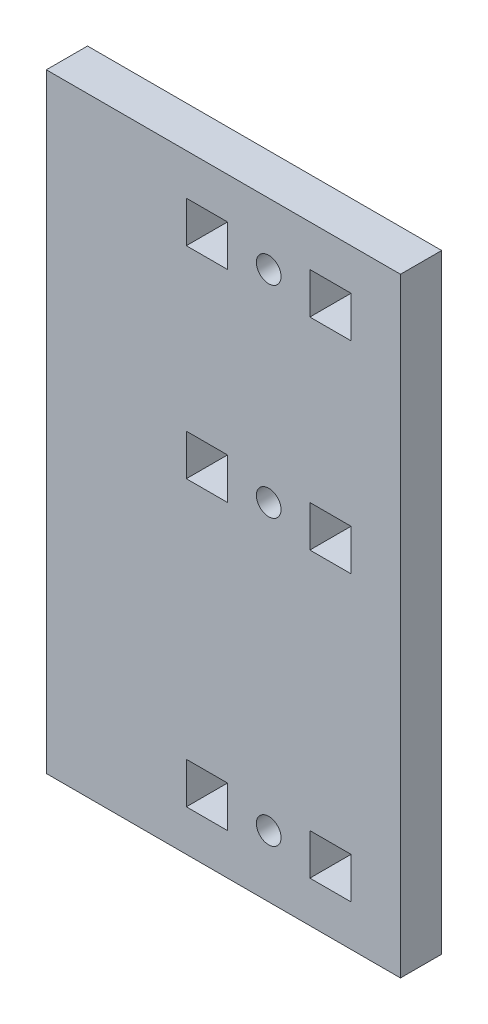
ISO-10303-21;
HEADER;
FILE_DESCRIPTION(('STEP AP214'),'2;1');
FILE_NAME('part.step','',(''),(''),'','','');
FILE_SCHEMA(('AUTOMOTIVE_DESIGN { 1 0 10303 214 1 1 1 1 }'));
ENDSEC;
DATA;
#1=APPLICATION_CONTEXT('core data for automotive mechanical design processes');
#2=APPLICATION_PROTOCOL_DEFINITION('international standard','automotive_design',2000,#1);
#3=PRODUCT_CONTEXT('',#1,'mechanical');
#4=PRODUCT('Part','Part','',(#3));
#5=PRODUCT_RELATED_PRODUCT_CATEGORY('part','',(#4));
#6=PRODUCT_DEFINITION_FORMATION('','',#4);
#7=PRODUCT_DEFINITION_CONTEXT('part definition',#1,'design');
#8=PRODUCT_DEFINITION('design','',#6,#7);
#9=PRODUCT_DEFINITION_SHAPE('','',#8);
#10=(LENGTH_UNIT() NAMED_UNIT(*) SI_UNIT(.MILLI.,.METRE.));
#11=(NAMED_UNIT(*) PLANE_ANGLE_UNIT() SI_UNIT($,.RADIAN.));
#12=(NAMED_UNIT(*) SI_UNIT($,.STERADIAN.) SOLID_ANGLE_UNIT());
#13=UNCERTAINTY_MEASURE_WITH_UNIT(LENGTH_MEASURE(1.E-05),#10,'distance_accuracy_value','');
#14=(GEOMETRIC_REPRESENTATION_CONTEXT(3) GLOBAL_UNCERTAINTY_ASSIGNED_CONTEXT((#13)) GLOBAL_UNIT_ASSIGNED_CONTEXT((#10,
#11,#12)) REPRESENTATION_CONTEXT('',''));
#15=CARTESIAN_POINT('',(0.,0.,0.));
#16=DIRECTION('',(0.,0.,1.));
#17=DIRECTION('',(1.,0.,0.));
#18=AXIS2_PLACEMENT_3D('',#15,#16,#17);
#19=CARTESIAN_POINT('',(0.,0.,5.));
#20=DIRECTION('',(0.,0.,-1.));
#21=DIRECTION('',(-1.,0.,0.));
#22=AXIS2_PLACEMENT_3D('',#19,#20,#21);
#23=PLANE('',#22);
#24=DIRECTION('',(0.,1.,0.));
#25=VECTOR('',#24,1.);
#26=CARTESIAN_POINT('',(-5.,-32.,5.));
#27=LINE('',#26,#25);
#28=CARTESIAN_POINT('',(-5.,-37.,5.));
#29=VERTEX_POINT('',#28);
#30=CARTESIAN_POINT('',(-5.,-32.,5.));
#31=VERTEX_POINT('',#30);
#32=EDGE_CURVE('E257',#29,#31,#27,.T.);
#33=ORIENTED_EDGE('',*,*,#32,.F.);
#34=DIRECTION('',(1.,0.,0.));
#35=VECTOR('',#34,1.);
#36=CARTESIAN_POINT('',(-5.,-37.,5.));
#37=LINE('',#36,#35);
#38=CARTESIAN_POINT('',(-10.,-37.,5.));
#39=VERTEX_POINT('',#38);
#40=EDGE_CURVE('E265',#39,#29,#37,.T.);
#41=ORIENTED_EDGE('',*,*,#40,.F.);
#42=DIRECTION('',(0.,-1.,0.));
#43=VECTOR('',#42,1.);
#44=CARTESIAN_POINT('',(-10.,-32.,5.));
#45=LINE('',#44,#43);
#46=CARTESIAN_POINT('',(-10.,-32.,5.));
#47=VERTEX_POINT('',#46);
#48=EDGE_CURVE('E262',#47,#39,#45,.T.);
#49=ORIENTED_EDGE('',*,*,#48,.F.);
#50=DIRECTION('',(-1.,0.,0.));
#51=VECTOR('',#50,1.);
#52=CARTESIAN_POINT('',(-5.,-32.,5.));
#53=LINE('',#52,#51);
#54=EDGE_CURVE('E259',#31,#47,#53,.T.);
#55=ORIENTED_EDGE('',*,*,#54,.F.);
#56=EDGE_LOOP('',(#33,#41,#49,#55));
#57=FACE_BOUND('',#56,.T.);
#58=DIRECTION('',(0.,1.,0.));
#59=VECTOR('',#58,1.);
#60=CARTESIAN_POINT('',(-5.,27.,5.));
#61=LINE('',#60,#59);
#62=CARTESIAN_POINT('',(-5.,22.,5.));
#63=VERTEX_POINT('',#62);
#64=CARTESIAN_POINT('',(-5.,27.,5.));
#65=VERTEX_POINT('',#64);
#66=EDGE_CURVE('E325',#63,#65,#61,.T.);
#67=ORIENTED_EDGE('',*,*,#66,.F.);
#68=DIRECTION('',(1.,0.,0.));
#69=VECTOR('',#68,1.);
#70=CARTESIAN_POINT('',(-5.,22.,5.));
#71=LINE('',#70,#69);
#72=CARTESIAN_POINT('',(-10.,22.,5.));
#73=VERTEX_POINT('',#72);
#74=EDGE_CURVE('E333',#73,#63,#71,.T.);
#75=ORIENTED_EDGE('',*,*,#74,.F.);
#76=DIRECTION('',(0.,-1.,0.));
#77=VECTOR('',#76,1.);
#78=CARTESIAN_POINT('',(-10.,27.,5.));
#79=LINE('',#78,#77);
#80=CARTESIAN_POINT('',(-10.,27.,5.));
#81=VERTEX_POINT('',#80);
#82=EDGE_CURVE('E330',#81,#73,#79,.T.);
#83=ORIENTED_EDGE('',*,*,#82,.F.);
#84=DIRECTION('',(-1.,0.,0.));
#85=VECTOR('',#84,1.);
#86=CARTESIAN_POINT('',(-5.,27.,5.));
#87=LINE('',#86,#85);
#88=EDGE_CURVE('E327',#65,#81,#87,.T.);
#89=ORIENTED_EDGE('',*,*,#88,.F.);
#90=EDGE_LOOP('',(#67,#75,#83,#89));
#91=FACE_BOUND('',#90,.T.);
#92=DIRECTION('',(0.,1.,0.));
#93=VECTOR('',#92,1.);
#94=CARTESIAN_POINT('',(-5.,2.5,5.));
#95=LINE('',#94,#93);
#96=CARTESIAN_POINT('',(-5.,-2.5,5.));
#97=VERTEX_POINT('',#96);
#98=CARTESIAN_POINT('',(-5.,2.5,5.));
#99=VERTEX_POINT('',#98);
#100=EDGE_CURVE('E393',#97,#99,#95,.T.);
#101=ORIENTED_EDGE('',*,*,#100,.F.);
#102=DIRECTION('',(1.,0.,0.));
#103=VECTOR('',#102,1.);
#104=CARTESIAN_POINT('',(-5.,-2.5,5.));
#105=LINE('',#104,#103);
#106=CARTESIAN_POINT('',(-10.,-2.5,5.));
#107=VERTEX_POINT('',#106);
#108=EDGE_CURVE('E401',#107,#97,#105,.T.);
#109=ORIENTED_EDGE('',*,*,#108,.F.);
#110=DIRECTION('',(0.,-1.,0.));
#111=VECTOR('',#110,1.);
#112=CARTESIAN_POINT('',(-10.,2.5,5.));
#113=LINE('',#112,#111);
#114=CARTESIAN_POINT('',(-10.,2.5,5.));
#115=VERTEX_POINT('',#114);
#116=EDGE_CURVE('E398',#115,#107,#113,.T.);
#117=ORIENTED_EDGE('',*,*,#116,.F.);
#118=DIRECTION('',(-1.,0.,0.));
#119=VECTOR('',#118,1.);
#120=CARTESIAN_POINT('',(-5.,2.5,5.));
#121=LINE('',#120,#119);
#122=EDGE_CURVE('E395',#99,#115,#121,.T.);
#123=ORIENTED_EDGE('',*,*,#122,.F.);
#124=EDGE_LOOP('',(#101,#109,#117,#123));
#125=FACE_BOUND('',#124,.T.);
#126=DIRECTION('',(0.,1.,0.));
#127=VECTOR('',#126,1.);
#128=CARTESIAN_POINT('',(16.,-42.,5.));
#129=LINE('',#128,#127);
#130=CARTESIAN_POINT('',(16.,-42.,5.));
#131=VERTEX_POINT('',#130);
#132=CARTESIAN_POINT('',(16.,32.,5.));
#133=VERTEX_POINT('',#132);
#134=EDGE_CURVE('E424',#131,#133,#129,.T.);
#135=ORIENTED_EDGE('',*,*,#134,.T.);
#136=DIRECTION('',(-1.,0.,0.));
#137=VECTOR('',#136,1.);
#138=CARTESIAN_POINT('',(-27.,32.,5.));
#139=LINE('',#138,#137);
#140=CARTESIAN_POINT('',(-27.,32.,5.));
#141=VERTEX_POINT('',#140);
#142=EDGE_CURVE('E427',#133,#141,#139,.T.);
#143=ORIENTED_EDGE('',*,*,#142,.T.);
#144=DIRECTION('',(0.,-1.,0.));
#145=VECTOR('',#144,1.);
#146=CARTESIAN_POINT('',(-27.,-42.,5.));
#147=LINE('',#146,#145);
#148=CARTESIAN_POINT('',(-27.,-42.,5.));
#149=VERTEX_POINT('',#148);
#150=EDGE_CURVE('E430',#141,#149,#147,.T.);
#151=ORIENTED_EDGE('',*,*,#150,.T.);
#152=DIRECTION('',(1.,0.,0.));
#153=VECTOR('',#152,1.);
#154=CARTESIAN_POINT('',(-27.,-42.,5.));
#155=LINE('',#154,#153);
#156=EDGE_CURVE('E432',#149,#131,#155,.T.);
#157=ORIENTED_EDGE('',*,*,#156,.T.);
#158=EDGE_LOOP('',(#135,#143,#151,#157));
#159=FACE_BOUND('',#158,.T.);
#160=DIRECTION('',(0.,-1.,0.));
#161=VECTOR('',#160,1.);
#162=CARTESIAN_POINT('',(5.,2.5,5.));
#163=LINE('',#162,#161);
#164=CARTESIAN_POINT('',(5.,2.5,5.));
#165=VERTEX_POINT('',#164);
#166=CARTESIAN_POINT('',(5.,-2.5,5.));
#167=VERTEX_POINT('',#166);
#168=EDGE_CURVE('E362',#165,#167,#163,.T.);
#169=ORIENTED_EDGE('',*,*,#168,.F.);
#170=DIRECTION('',(-1.,0.,0.));
#171=VECTOR('',#170,1.);
#172=CARTESIAN_POINT('',(5.,2.5,5.));
#173=LINE('',#172,#171);
#174=CARTESIAN_POINT('',(10.,2.5,5.));
#175=VERTEX_POINT('',#174);
#176=EDGE_CURVE('E370',#175,#165,#173,.T.);
#177=ORIENTED_EDGE('',*,*,#176,.F.);
#178=DIRECTION('',(0.,1.,0.));
#179=VECTOR('',#178,1.);
#180=CARTESIAN_POINT('',(10.,2.5,5.));
#181=LINE('',#180,#179);
#182=CARTESIAN_POINT('',(10.,-2.5,5.));
#183=VERTEX_POINT('',#182);
#184=EDGE_CURVE('E367',#183,#175,#181,.T.);
#185=ORIENTED_EDGE('',*,*,#184,.F.);
#186=DIRECTION('',(1.,0.,0.));
#187=VECTOR('',#186,1.);
#188=CARTESIAN_POINT('',(5.,-2.5,5.));
#189=LINE('',#188,#187);
#190=EDGE_CURVE('E364',#167,#183,#189,.T.);
#191=ORIENTED_EDGE('',*,*,#190,.F.);
#192=EDGE_LOOP('',(#169,#177,#185,#191));
#193=FACE_BOUND('',#192,.T.);
#194=CARTESIAN_POINT('',(0.,0.,5.));
#195=DIRECTION('',(0.,0.,1.));
#196=DIRECTION('',(1.,0.,0.));
#197=AXIS2_PLACEMENT_3D('',#194,#195,#196);
#198=CIRCLE('',#197,1.5);
#199=CARTESIAN_POINT('',(1.5,0.,5.));
#200=VERTEX_POINT('',#199);
#201=EDGE_CURVE('E356',#200,#200,#198,.T.);
#202=ORIENTED_EDGE('',*,*,#201,.F.);
#203=EDGE_LOOP('',(#202));
#204=FACE_BOUND('',#203,.T.);
#205=DIRECTION('',(0.,-1.,0.));
#206=VECTOR('',#205,1.);
#207=CARTESIAN_POINT('',(5.,27.,5.));
#208=LINE('',#207,#206);
#209=CARTESIAN_POINT('',(5.,27.,5.));
#210=VERTEX_POINT('',#209);
#211=CARTESIAN_POINT('',(5.,22.,5.));
#212=VERTEX_POINT('',#211);
#213=EDGE_CURVE('E294',#210,#212,#208,.T.);
#214=ORIENTED_EDGE('',*,*,#213,.F.);
#215=DIRECTION('',(-1.,0.,0.));
#216=VECTOR('',#215,1.);
#217=CARTESIAN_POINT('',(5.,27.,5.));
#218=LINE('',#217,#216);
#219=CARTESIAN_POINT('',(10.,27.,5.));
#220=VERTEX_POINT('',#219);
#221=EDGE_CURVE('E302',#220,#210,#218,.T.);
#222=ORIENTED_EDGE('',*,*,#221,.F.);
#223=DIRECTION('',(0.,1.,0.));
#224=VECTOR('',#223,1.);
#225=CARTESIAN_POINT('',(10.,27.,5.));
#226=LINE('',#225,#224);
#227=CARTESIAN_POINT('',(10.,22.,5.));
#228=VERTEX_POINT('',#227);
#229=EDGE_CURVE('E299',#228,#220,#226,.T.);
#230=ORIENTED_EDGE('',*,*,#229,.F.);
#231=DIRECTION('',(1.,0.,0.));
#232=VECTOR('',#231,1.);
#233=CARTESIAN_POINT('',(5.,22.,5.));
#234=LINE('',#233,#232);
#235=EDGE_CURVE('E296',#212,#228,#234,.T.);
#236=ORIENTED_EDGE('',*,*,#235,.F.);
#237=EDGE_LOOP('',(#214,#222,#230,#236));
#238=FACE_BOUND('',#237,.T.);
#239=CARTESIAN_POINT('',(0.,24.5,5.));
#240=DIRECTION('',(0.,0.,1.));
#241=DIRECTION('',(1.,0.,0.));
#242=AXIS2_PLACEMENT_3D('',#239,#240,#241);
#243=CIRCLE('',#242,1.5);
#244=CARTESIAN_POINT('',(1.5,24.5,5.));
#245=VERTEX_POINT('',#244);
#246=EDGE_CURVE('E288',#245,#245,#243,.T.);
#247=ORIENTED_EDGE('',*,*,#246,.F.);
#248=EDGE_LOOP('',(#247));
#249=FACE_BOUND('',#248,.T.);
#250=DIRECTION('',(0.,-1.,0.));
#251=VECTOR('',#250,1.);
#252=CARTESIAN_POINT('',(5.,-32.,5.));
#253=LINE('',#252,#251);
#254=CARTESIAN_POINT('',(5.,-32.,5.));
#255=VERTEX_POINT('',#254);
#256=CARTESIAN_POINT('',(5.,-37.,5.));
#257=VERTEX_POINT('',#256);
#258=EDGE_CURVE('E218',#255,#257,#253,.T.);
#259=ORIENTED_EDGE('',*,*,#258,.F.);
#260=DIRECTION('',(-1.,0.,0.));
#261=VECTOR('',#260,1.);
#262=CARTESIAN_POINT('',(5.,-32.,5.));
#263=LINE('',#262,#261);
#264=CARTESIAN_POINT('',(10.,-32.,5.));
#265=VERTEX_POINT('',#264);
#266=EDGE_CURVE('E241',#265,#255,#263,.T.);
#267=ORIENTED_EDGE('',*,*,#266,.F.);
#268=DIRECTION('',(0.,1.,0.));
#269=VECTOR('',#268,1.);
#270=CARTESIAN_POINT('',(10.,-32.,5.));
#271=LINE('',#270,#269);
#272=CARTESIAN_POINT('',(10.,-37.,5.));
#273=VERTEX_POINT('',#272);
#274=EDGE_CURVE('E239',#273,#265,#271,.T.);
#275=ORIENTED_EDGE('',*,*,#274,.F.);
#276=DIRECTION('',(1.,0.,0.));
#277=VECTOR('',#276,1.);
#278=CARTESIAN_POINT('',(5.,-37.,5.));
#279=LINE('',#278,#277);
#280=EDGE_CURVE('E226',#257,#273,#279,.T.);
#281=ORIENTED_EDGE('',*,*,#280,.F.);
#282=EDGE_LOOP('',(#259,#267,#275,#281));
#283=FACE_BOUND('',#282,.T.);
#284=CARTESIAN_POINT('',(0.,-34.5,5.));
#285=DIRECTION('',(0.,0.,1.));
#286=DIRECTION('',(1.,0.,0.));
#287=AXIS2_PLACEMENT_3D('',#284,#285,#286);
#288=CIRCLE('',#287,1.5);
#289=CARTESIAN_POINT('',(1.5,-34.5,5.));
#290=VERTEX_POINT('',#289);
#291=EDGE_CURVE('E247',#290,#290,#288,.T.);
#292=ORIENTED_EDGE('',*,*,#291,.F.);
#293=EDGE_LOOP('',(#292));
#294=FACE_BOUND('',#293,.T.);
#295=ADVANCED_FACE('F33',(#57,#91,#125,#159,#193,#204,#238,#249,#283,#294),#23,.F.);
#296=CARTESIAN_POINT('',(0.,0.,0.));
#297=DIRECTION('',(0.,0.,-1.));
#298=DIRECTION('',(-1.,0.,0.));
#299=AXIS2_PLACEMENT_3D('',#296,#297,#298);
#300=PLANE('',#299);
#301=DIRECTION('',(-1.,0.,0.));
#302=VECTOR('',#301,1.);
#303=CARTESIAN_POINT('',(5.,-32.,0.));
#304=LINE('',#303,#302);
#305=CARTESIAN_POINT('',(10.,-32.,0.));
#306=VERTEX_POINT('',#305);
#307=CARTESIAN_POINT('',(5.,-32.,0.));
#308=VERTEX_POINT('',#307);
#309=EDGE_CURVE('E227',#306,#308,#304,.T.);
#310=ORIENTED_EDGE('',*,*,#309,.T.);
#311=DIRECTION('',(0.,-1.,0.));
#312=VECTOR('',#311,1.);
#313=CARTESIAN_POINT('',(5.,-32.,0.));
#314=LINE('',#313,#312);
#315=CARTESIAN_POINT('',(5.,-37.,0.));
#316=VERTEX_POINT('',#315);
#317=EDGE_CURVE('E56',#308,#316,#314,.T.);
#318=ORIENTED_EDGE('',*,*,#317,.T.);
#319=DIRECTION('',(1.,0.,0.));
#320=VECTOR('',#319,1.);
#321=CARTESIAN_POINT('',(5.,-37.,0.));
#322=LINE('',#321,#320);
#323=CARTESIAN_POINT('',(10.,-37.,0.));
#324=VERTEX_POINT('',#323);
#325=EDGE_CURVE('E233',#316,#324,#322,.T.);
#326=ORIENTED_EDGE('',*,*,#325,.T.);
#327=DIRECTION('',(0.,1.,0.));
#328=VECTOR('',#327,1.);
#329=CARTESIAN_POINT('',(10.,-32.,0.));
#330=LINE('',#329,#328);
#331=EDGE_CURVE('E249',#324,#306,#330,.T.);
#332=ORIENTED_EDGE('',*,*,#331,.T.);
#333=EDGE_LOOP('',(#310,#318,#326,#332));
#334=FACE_BOUND('',#333,.T.);
#335=DIRECTION('',(1.,0.,0.));
#336=VECTOR('',#335,1.);
#337=CARTESIAN_POINT('',(-5.,-37.,0.));
#338=LINE('',#337,#336);
#339=CARTESIAN_POINT('',(-10.,-37.,0.));
#340=VERTEX_POINT('',#339);
#341=CARTESIAN_POINT('',(-5.,-37.,0.));
#342=VERTEX_POINT('',#341);
#343=EDGE_CURVE('E260',#340,#342,#338,.T.);
#344=ORIENTED_EDGE('',*,*,#343,.T.);
#345=DIRECTION('',(0.,1.,0.));
#346=VECTOR('',#345,1.);
#347=CARTESIAN_POINT('',(-5.,-32.,0.));
#348=LINE('',#347,#346);
#349=CARTESIAN_POINT('',(-5.,-32.,0.));
#350=VERTEX_POINT('',#349);
#351=EDGE_CURVE('E234',#342,#350,#348,.T.);
#352=ORIENTED_EDGE('',*,*,#351,.T.);
#353=DIRECTION('',(-1.,0.,0.));
#354=VECTOR('',#353,1.);
#355=CARTESIAN_POINT('',(-5.,-32.,0.));
#356=LINE('',#355,#354);
#357=CARTESIAN_POINT('',(-10.,-32.,0.));
#358=VERTEX_POINT('',#357);
#359=EDGE_CURVE('E270',#350,#358,#356,.T.);
#360=ORIENTED_EDGE('',*,*,#359,.T.);
#361=DIRECTION('',(0.,-1.,0.));
#362=VECTOR('',#361,1.);
#363=CARTESIAN_POINT('',(-10.,-32.,0.));
#364=LINE('',#363,#362);
#365=EDGE_CURVE('E273',#358,#340,#364,.T.);
#366=ORIENTED_EDGE('',*,*,#365,.T.);
#367=EDGE_LOOP('',(#344,#352,#360,#366));
#368=FACE_BOUND('',#367,.T.);
#369=CARTESIAN_POINT('',(0.,24.5,0.));
#370=DIRECTION('',(0.,0.,1.));
#371=DIRECTION('',(1.,0.,0.));
#372=AXIS2_PLACEMENT_3D('',#369,#370,#371);
#373=CIRCLE('',#372,1.5);
#374=CARTESIAN_POINT('',(1.5,24.5,0.));
#375=VERTEX_POINT('',#374);
#376=EDGE_CURVE('E287',#375,#375,#373,.T.);
#377=ORIENTED_EDGE('',*,*,#376,.T.);
#378=EDGE_LOOP('',(#377));
#379=FACE_BOUND('',#378,.T.);
#380=DIRECTION('',(-1.,0.,0.));
#381=VECTOR('',#380,1.);
#382=CARTESIAN_POINT('',(5.,2.5,0.));
#383=LINE('',#382,#381);
#384=CARTESIAN_POINT('',(10.,2.5,0.));
#385=VERTEX_POINT('',#384);
#386=CARTESIAN_POINT('',(5.,2.5,0.));
#387=VERTEX_POINT('',#386);
#388=EDGE_CURVE('E365',#385,#387,#383,.T.);
#389=ORIENTED_EDGE('',*,*,#388,.T.);
#390=DIRECTION('',(0.,-1.,0.));
#391=VECTOR('',#390,1.);
#392=CARTESIAN_POINT('',(5.,2.5,0.));
#393=LINE('',#392,#391);
#394=CARTESIAN_POINT('',(5.,-2.5,0.));
#395=VERTEX_POINT('',#394);
#396=EDGE_CURVE('E359',#387,#395,#393,.T.);
#397=ORIENTED_EDGE('',*,*,#396,.T.);
#398=DIRECTION('',(1.,0.,0.));
#399=VECTOR('',#398,1.);
#400=CARTESIAN_POINT('',(5.,-2.5,0.));
#401=LINE('',#400,#399);
#402=CARTESIAN_POINT('',(10.,-2.5,0.));
#403=VERTEX_POINT('',#402);
#404=EDGE_CURVE('E375',#395,#403,#401,.T.);
#405=ORIENTED_EDGE('',*,*,#404,.T.);
#406=DIRECTION('',(0.,1.,0.));
#407=VECTOR('',#406,1.);
#408=CARTESIAN_POINT('',(10.,2.5,0.));
#409=LINE('',#408,#407);
#410=EDGE_CURVE('E378',#403,#385,#409,.T.);
#411=ORIENTED_EDGE('',*,*,#410,.T.);
#412=EDGE_LOOP('',(#389,#397,#405,#411));
#413=FACE_BOUND('',#412,.T.);
#414=DIRECTION('',(1.,0.,0.));
#415=VECTOR('',#414,1.);
#416=CARTESIAN_POINT('',(-5.,-2.5,0.));
#417=LINE('',#416,#415);
#418=CARTESIAN_POINT('',(-10.,-2.5,0.));
#419=VERTEX_POINT('',#418);
#420=CARTESIAN_POINT('',(-5.,-2.5,0.));
#421=VERTEX_POINT('',#420);
#422=EDGE_CURVE('E396',#419,#421,#417,.T.);
#423=ORIENTED_EDGE('',*,*,#422,.T.);
#424=DIRECTION('',(0.,1.,0.));
#425=VECTOR('',#424,1.);
#426=CARTESIAN_POINT('',(-5.,2.5,0.));
#427=LINE('',#426,#425);
#428=CARTESIAN_POINT('',(-5.,2.5,0.));
#429=VERTEX_POINT('',#428);
#430=EDGE_CURVE('E392',#421,#429,#427,.T.);
#431=ORIENTED_EDGE('',*,*,#430,.T.);
#432=DIRECTION('',(-1.,0.,0.));
#433=VECTOR('',#432,1.);
#434=CARTESIAN_POINT('',(-5.,2.5,0.));
#435=LINE('',#434,#433);
#436=CARTESIAN_POINT('',(-10.,2.5,0.));
#437=VERTEX_POINT('',#436);
#438=EDGE_CURVE('E406',#429,#437,#435,.T.);
#439=ORIENTED_EDGE('',*,*,#438,.T.);
#440=DIRECTION('',(0.,-1.,0.));
#441=VECTOR('',#440,1.);
#442=CARTESIAN_POINT('',(-10.,2.5,0.));
#443=LINE('',#442,#441);
#444=EDGE_CURVE('E409',#437,#419,#443,.T.);
#445=ORIENTED_EDGE('',*,*,#444,.T.);
#446=EDGE_LOOP('',(#423,#431,#439,#445));
#447=FACE_BOUND('',#446,.T.);
#448=DIRECTION('',(0.,1.,0.));
#449=VECTOR('',#448,1.);
#450=CARTESIAN_POINT('',(16.,-42.,0.));
#451=LINE('',#450,#449);
#452=CARTESIAN_POINT('',(16.,-42.,0.));
#453=VERTEX_POINT('',#452);
#454=CARTESIAN_POINT('',(16.,32.,0.));
#455=VERTEX_POINT('',#454);
#456=EDGE_CURVE('E423',#453,#455,#451,.T.);
#457=ORIENTED_EDGE('',*,*,#456,.F.);
#458=DIRECTION('',(1.,0.,0.));
#459=VECTOR('',#458,1.);
#460=CARTESIAN_POINT('',(-27.,-42.,0.));
#461=LINE('',#460,#459);
#462=CARTESIAN_POINT('',(-27.,-42.,0.));
#463=VERTEX_POINT('',#462);
#464=EDGE_CURVE('E428',#463,#453,#461,.T.);
#465=ORIENTED_EDGE('',*,*,#464,.F.);
#466=DIRECTION('',(0.,-1.,0.));
#467=VECTOR('',#466,1.);
#468=CARTESIAN_POINT('',(-27.,-42.,0.));
#469=LINE('',#468,#467);
#470=CARTESIAN_POINT('',(-27.,32.,0.));
#471=VERTEX_POINT('',#470);
#472=EDGE_CURVE('E439',#471,#463,#469,.T.);
#473=ORIENTED_EDGE('',*,*,#472,.F.);
#474=DIRECTION('',(-1.,0.,0.));
#475=VECTOR('',#474,1.);
#476=CARTESIAN_POINT('',(-27.,32.,0.));
#477=LINE('',#476,#475);
#478=EDGE_CURVE('E437',#455,#471,#477,.T.);
#479=ORIENTED_EDGE('',*,*,#478,.F.);
#480=EDGE_LOOP('',(#457,#465,#473,#479));
#481=FACE_BOUND('',#480,.T.);
#482=CARTESIAN_POINT('',(0.,0.,0.));
#483=DIRECTION('',(0.,0.,1.));
#484=DIRECTION('',(1.,0.,0.));
#485=AXIS2_PLACEMENT_3D('',#482,#483,#484);
#486=CIRCLE('',#485,1.5);
#487=CARTESIAN_POINT('',(1.5,0.,0.));
#488=VERTEX_POINT('',#487);
#489=EDGE_CURVE('E355',#488,#488,#486,.T.);
#490=ORIENTED_EDGE('',*,*,#489,.T.);
#491=EDGE_LOOP('',(#490));
#492=FACE_BOUND('',#491,.T.);
#493=DIRECTION('',(1.,0.,0.));
#494=VECTOR('',#493,1.);
#495=CARTESIAN_POINT('',(-5.,22.,0.));
#496=LINE('',#495,#494);
#497=CARTESIAN_POINT('',(-10.,22.,0.));
#498=VERTEX_POINT('',#497);
#499=CARTESIAN_POINT('',(-5.,22.,0.));
#500=VERTEX_POINT('',#499);
#501=EDGE_CURVE('E328',#498,#500,#496,.T.);
#502=ORIENTED_EDGE('',*,*,#501,.T.);
#503=DIRECTION('',(0.,1.,0.));
#504=VECTOR('',#503,1.);
#505=CARTESIAN_POINT('',(-5.,27.,0.));
#506=LINE('',#505,#504);
#507=CARTESIAN_POINT('',(-5.,27.,0.));
#508=VERTEX_POINT('',#507);
#509=EDGE_CURVE('E324',#500,#508,#506,.T.);
#510=ORIENTED_EDGE('',*,*,#509,.T.);
#511=DIRECTION('',(-1.,0.,0.));
#512=VECTOR('',#511,1.);
#513=CARTESIAN_POINT('',(-5.,27.,0.));
#514=LINE('',#513,#512);
#515=CARTESIAN_POINT('',(-10.,27.,0.));
#516=VERTEX_POINT('',#515);
#517=EDGE_CURVE('E338',#508,#516,#514,.T.);
#518=ORIENTED_EDGE('',*,*,#517,.T.);
#519=DIRECTION('',(0.,-1.,0.));
#520=VECTOR('',#519,1.);
#521=CARTESIAN_POINT('',(-10.,27.,0.));
#522=LINE('',#521,#520);
#523=EDGE_CURVE('E341',#516,#498,#522,.T.);
#524=ORIENTED_EDGE('',*,*,#523,.T.);
#525=EDGE_LOOP('',(#502,#510,#518,#524));
#526=FACE_BOUND('',#525,.T.);
#527=DIRECTION('',(-1.,0.,0.));
#528=VECTOR('',#527,1.);
#529=CARTESIAN_POINT('',(5.,27.,0.));
#530=LINE('',#529,#528);
#531=CARTESIAN_POINT('',(10.,27.,0.));
#532=VERTEX_POINT('',#531);
#533=CARTESIAN_POINT('',(5.,27.,0.));
#534=VERTEX_POINT('',#533);
#535=EDGE_CURVE('E297',#532,#534,#530,.T.);
#536=ORIENTED_EDGE('',*,*,#535,.T.);
#537=DIRECTION('',(0.,-1.,0.));
#538=VECTOR('',#537,1.);
#539=CARTESIAN_POINT('',(5.,27.,0.));
#540=LINE('',#539,#538);
#541=CARTESIAN_POINT('',(5.,22.,0.));
#542=VERTEX_POINT('',#541);
#543=EDGE_CURVE('E291',#534,#542,#540,.T.);
#544=ORIENTED_EDGE('',*,*,#543,.T.);
#545=DIRECTION('',(1.,0.,0.));
#546=VECTOR('',#545,1.);
#547=CARTESIAN_POINT('',(5.,22.,0.));
#548=LINE('',#547,#546);
#549=CARTESIAN_POINT('',(10.,22.,0.));
#550=VERTEX_POINT('',#549);
#551=EDGE_CURVE('E307',#542,#550,#548,.T.);
#552=ORIENTED_EDGE('',*,*,#551,.T.);
#553=DIRECTION('',(0.,1.,0.));
#554=VECTOR('',#553,1.);
#555=CARTESIAN_POINT('',(10.,27.,0.));
#556=LINE('',#555,#554);
#557=EDGE_CURVE('E310',#550,#532,#556,.T.);
#558=ORIENTED_EDGE('',*,*,#557,.T.);
#559=EDGE_LOOP('',(#536,#544,#552,#558));
#560=FACE_BOUND('',#559,.T.);
#561=CARTESIAN_POINT('',(0.,-34.5,0.));
#562=DIRECTION('',(0.,0.,1.));
#563=DIRECTION('',(1.,0.,0.));
#564=AXIS2_PLACEMENT_3D('',#561,#562,#563);
#565=CIRCLE('',#564,1.5);
#566=CARTESIAN_POINT('',(1.5,-34.5,0.));
#567=VERTEX_POINT('',#566);
#568=EDGE_CURVE('E614',#567,#567,#565,.T.);
#569=ORIENTED_EDGE('',*,*,#568,.T.);
#570=EDGE_LOOP('',(#569));
#571=FACE_BOUND('',#570,.T.);
#572=ADVANCED_FACE('F457',(#334,#368,#379,#413,#447,#481,#492,#526,#560,#571),#300,.T.);
#573=CARTESIAN_POINT('',(16.,-42.,5.));
#574=DIRECTION('',(-1.,0.,0.));
#575=DIRECTION('',(0.,0.,1.));
#576=AXIS2_PLACEMENT_3D('',#573,#574,#575);
#577=PLANE('',#576);
#578=ORIENTED_EDGE('',*,*,#456,.T.);
#579=DIRECTION('',(0.,0.,-1.));
#580=VECTOR('',#579,1.);
#581=CARTESIAN_POINT('',(16.,32.,5.));
#582=LINE('',#581,#580);
#583=EDGE_CURVE('E11',#133,#455,#582,.T.);
#584=ORIENTED_EDGE('',*,*,#583,.F.);
#585=ORIENTED_EDGE('',*,*,#134,.F.);
#586=DIRECTION('',(0.,0.,-1.));
#587=VECTOR('',#586,1.);
#588=CARTESIAN_POINT('',(16.,-42.,5.));
#589=LINE('',#588,#587);
#590=EDGE_CURVE('E434',#131,#453,#589,.T.);
#591=ORIENTED_EDGE('',*,*,#590,.T.);
#592=EDGE_LOOP('',(#578,#584,#585,#591));
#593=FACE_BOUND('',#592,.T.);
#594=ADVANCED_FACE('F35',(#593),#577,.F.);
#595=CARTESIAN_POINT('',(-27.,32.,5.));
#596=DIRECTION('',(0.,-1.,0.));
#597=DIRECTION('',(0.,0.,-1.));
#598=AXIS2_PLACEMENT_3D('',#595,#596,#597);
#599=PLANE('',#598);
#600=ORIENTED_EDGE('',*,*,#478,.T.);
#601=DIRECTION('',(0.,0.,-1.));
#602=VECTOR('',#601,1.);
#603=CARTESIAN_POINT('',(-27.,32.,5.));
#604=LINE('',#603,#602);
#605=EDGE_CURVE('E41',#141,#471,#604,.T.);
#606=ORIENTED_EDGE('',*,*,#605,.F.);
#607=ORIENTED_EDGE('',*,*,#142,.F.);
#608=ORIENTED_EDGE('',*,*,#583,.T.);
#609=EDGE_LOOP('',(#600,#606,#607,#608));
#610=FACE_BOUND('',#609,.T.);
#611=ADVANCED_FACE('F468',(#610),#599,.F.);
#612=CARTESIAN_POINT('',(-27.,-42.,5.));
#613=DIRECTION('',(1.,0.,0.));
#614=DIRECTION('',(0.,0.,-1.));
#615=AXIS2_PLACEMENT_3D('',#612,#613,#614);
#616=PLANE('',#615);
#617=ORIENTED_EDGE('',*,*,#472,.T.);
#618=DIRECTION('',(0.,0.,-1.));
#619=VECTOR('',#618,1.);
#620=CARTESIAN_POINT('',(-27.,-42.,5.));
#621=LINE('',#620,#619);
#622=EDGE_CURVE('E444',#149,#463,#621,.T.);
#623=ORIENTED_EDGE('',*,*,#622,.F.);
#624=ORIENTED_EDGE('',*,*,#150,.F.);
#625=ORIENTED_EDGE('',*,*,#605,.T.);
#626=EDGE_LOOP('',(#617,#623,#624,#625));
#627=FACE_BOUND('',#626,.T.);
#628=ADVANCED_FACE('F451',(#627),#616,.F.);
#629=CARTESIAN_POINT('',(-27.,-42.,5.));
#630=DIRECTION('',(0.,1.,0.));
#631=DIRECTION('',(0.,0.,1.));
#632=AXIS2_PLACEMENT_3D('',#629,#630,#631);
#633=PLANE('',#632);
#634=ORIENTED_EDGE('',*,*,#464,.T.);
#635=ORIENTED_EDGE('',*,*,#590,.F.);
#636=ORIENTED_EDGE('',*,*,#156,.F.);
#637=ORIENTED_EDGE('',*,*,#622,.T.);
#638=EDGE_LOOP('',(#634,#635,#636,#637));
#639=FACE_BOUND('',#638,.T.);
#640=ADVANCED_FACE('F461',(#639),#633,.F.);
#641=CARTESIAN_POINT('',(-5.,2.5,5.));
#642=DIRECTION('',(-1.,0.,0.));
#643=DIRECTION('',(0.,0.,1.));
#644=AXIS2_PLACEMENT_3D('',#641,#642,#643);
#645=PLANE('',#644);
#646=ORIENTED_EDGE('',*,*,#430,.F.);
#647=DIRECTION('',(0.,0.,-1.));
#648=VECTOR('',#647,1.);
#649=CARTESIAN_POINT('',(-5.,-2.5,5.));
#650=LINE('',#649,#648);
#651=EDGE_CURVE('E403',#97,#421,#650,.T.);
#652=ORIENTED_EDGE('',*,*,#651,.F.);
#653=ORIENTED_EDGE('',*,*,#100,.T.);
#654=DIRECTION('',(0.,0.,-1.));
#655=VECTOR('',#654,1.);
#656=CARTESIAN_POINT('',(-5.,2.5,5.));
#657=LINE('',#656,#655);
#658=EDGE_CURVE('E420',#99,#429,#657,.T.);
#659=ORIENTED_EDGE('',*,*,#658,.T.);
#660=EDGE_LOOP('',(#646,#652,#653,#659));
#661=FACE_BOUND('',#660,.T.);
#662=ADVANCED_FACE('F486',(#661),#645,.T.);
#663=CARTESIAN_POINT('',(-5.,2.5,5.));
#664=DIRECTION('',(0.,-1.,0.));
#665=DIRECTION('',(1.,0.,0.));
#666=AXIS2_PLACEMENT_3D('',#663,#664,#665);
#667=PLANE('',#666);
#668=ORIENTED_EDGE('',*,*,#438,.F.);
#669=ORIENTED_EDGE('',*,*,#658,.F.);
#670=ORIENTED_EDGE('',*,*,#122,.T.);
#671=DIRECTION('',(0.,0.,-1.));
#672=VECTOR('',#671,1.);
#673=CARTESIAN_POINT('',(-10.,2.5,5.));
#674=LINE('',#673,#672);
#675=EDGE_CURVE('E418',#115,#437,#674,.T.);
#676=ORIENTED_EDGE('',*,*,#675,.T.);
#677=EDGE_LOOP('',(#668,#669,#670,#676));
#678=FACE_BOUND('',#677,.T.);
#679=ADVANCED_FACE('F493',(#678),#667,.T.);
#680=CARTESIAN_POINT('',(-10.,2.5,5.));
#681=DIRECTION('',(1.,0.,0.));
#682=DIRECTION('',(0.,0.,-1.));
#683=AXIS2_PLACEMENT_3D('',#680,#681,#682);
#684=PLANE('',#683);
#685=ORIENTED_EDGE('',*,*,#444,.F.);
#686=ORIENTED_EDGE('',*,*,#675,.F.);
#687=ORIENTED_EDGE('',*,*,#116,.T.);
#688=DIRECTION('',(0.,0.,-1.));
#689=VECTOR('',#688,1.);
#690=CARTESIAN_POINT('',(-10.,-2.5,5.));
#691=LINE('',#690,#689);
#692=EDGE_CURVE('E416',#107,#419,#691,.T.);
#693=ORIENTED_EDGE('',*,*,#692,.T.);
#694=EDGE_LOOP('',(#685,#686,#687,#693));
#695=FACE_BOUND('',#694,.T.);
#696=ADVANCED_FACE('F498',(#695),#684,.T.);
#697=CARTESIAN_POINT('',(-5.,-2.5,5.));
#698=DIRECTION('',(0.,1.,0.));
#699=DIRECTION('',(-1.,0.,0.));
#700=AXIS2_PLACEMENT_3D('',#697,#698,#699);
#701=PLANE('',#700);
#702=ORIENTED_EDGE('',*,*,#422,.F.);
#703=ORIENTED_EDGE('',*,*,#692,.F.);
#704=ORIENTED_EDGE('',*,*,#108,.T.);
#705=ORIENTED_EDGE('',*,*,#651,.T.);
#706=EDGE_LOOP('',(#702,#703,#704,#705));
#707=FACE_BOUND('',#706,.T.);
#708=ADVANCED_FACE('F506',(#707),#701,.T.);
#709=CARTESIAN_POINT('',(5.,2.5,5.));
#710=DIRECTION('',(1.,0.,0.));
#711=DIRECTION('',(0.,0.,-1.));
#712=AXIS2_PLACEMENT_3D('',#709,#710,#711);
#713=PLANE('',#712);
#714=ORIENTED_EDGE('',*,*,#396,.F.);
#715=DIRECTION('',(0.,0.,-1.));
#716=VECTOR('',#715,1.);
#717=CARTESIAN_POINT('',(5.,2.5,5.));
#718=LINE('',#717,#716);
#719=EDGE_CURVE('E372',#165,#387,#718,.T.);
#720=ORIENTED_EDGE('',*,*,#719,.F.);
#721=ORIENTED_EDGE('',*,*,#168,.T.);
#722=DIRECTION('',(0.,0.,-1.));
#723=VECTOR('',#722,1.);
#724=CARTESIAN_POINT('',(5.,-2.5,5.));
#725=LINE('',#724,#723);
#726=EDGE_CURVE('E389',#167,#395,#725,.T.);
#727=ORIENTED_EDGE('',*,*,#726,.T.);
#728=EDGE_LOOP('',(#714,#720,#721,#727));
#729=FACE_BOUND('',#728,.T.);
#730=ADVANCED_FACE('F519',(#729),#713,.T.);
#731=CARTESIAN_POINT('',(5.,-2.5,5.));
#732=DIRECTION('',(0.,1.,0.));
#733=DIRECTION('',(0.,0.,1.));
#734=AXIS2_PLACEMENT_3D('',#731,#732,#733);
#735=PLANE('',#734);
#736=ORIENTED_EDGE('',*,*,#404,.F.);
#737=ORIENTED_EDGE('',*,*,#726,.F.);
#738=ORIENTED_EDGE('',*,*,#190,.T.);
#739=DIRECTION('',(0.,0.,-1.));
#740=VECTOR('',#739,1.);
#741=CARTESIAN_POINT('',(10.,-2.5,5.));
#742=LINE('',#741,#740);
#743=EDGE_CURVE('E387',#183,#403,#742,.T.);
#744=ORIENTED_EDGE('',*,*,#743,.T.);
#745=EDGE_LOOP('',(#736,#737,#738,#744));
#746=FACE_BOUND('',#745,.T.);
#747=ADVANCED_FACE('F524',(#746),#735,.T.);
#748=CARTESIAN_POINT('',(10.,2.5,5.));
#749=DIRECTION('',(-1.,0.,0.));
#750=DIRECTION('',(0.,0.,1.));
#751=AXIS2_PLACEMENT_3D('',#748,#749,#750);
#752=PLANE('',#751);
#753=ORIENTED_EDGE('',*,*,#410,.F.);
#754=ORIENTED_EDGE('',*,*,#743,.F.);
#755=ORIENTED_EDGE('',*,*,#184,.T.);
#756=DIRECTION('',(0.,0.,-1.));
#757=VECTOR('',#756,1.);
#758=CARTESIAN_POINT('',(10.,2.5,5.));
#759=LINE('',#758,#757);
#760=EDGE_CURVE('E385',#175,#385,#759,.T.);
#761=ORIENTED_EDGE('',*,*,#760,.T.);
#762=EDGE_LOOP('',(#753,#754,#755,#761));
#763=FACE_BOUND('',#762,.T.);
#764=ADVANCED_FACE('F528',(#763),#752,.T.);
#765=CARTESIAN_POINT('',(5.,2.5,5.));
#766=DIRECTION('',(0.,-1.,0.));
#767=DIRECTION('',(0.,0.,-1.));
#768=AXIS2_PLACEMENT_3D('',#765,#766,#767);
#769=PLANE('',#768);
#770=ORIENTED_EDGE('',*,*,#388,.F.);
#771=ORIENTED_EDGE('',*,*,#760,.F.);
#772=ORIENTED_EDGE('',*,*,#176,.T.);
#773=ORIENTED_EDGE('',*,*,#719,.T.);
#774=EDGE_LOOP('',(#770,#771,#772,#773));
#775=FACE_BOUND('',#774,.T.);
#776=ADVANCED_FACE('F532',(#775),#769,.T.);
#777=CARTESIAN_POINT('',(0.,0.,5.));
#778=DIRECTION('',(0.,0.,-1.));
#779=DIRECTION('',(-1.,0.,0.));
#780=AXIS2_PLACEMENT_3D('',#777,#778,#779);
#781=CYLINDRICAL_SURFACE('',#780,1.5);
#782=ORIENTED_EDGE('',*,*,#201,.T.);
#783=EDGE_LOOP('',(#782));
#784=FACE_BOUND('',#783,.T.);
#785=ORIENTED_EDGE('',*,*,#489,.F.);
#786=EDGE_LOOP('',(#785));
#787=FACE_BOUND('',#786,.T.);
#788=ADVANCED_FACE('F536',(#784,#787),#781,.F.);
#789=CARTESIAN_POINT('',(-5.,27.,5.));
#790=DIRECTION('',(-1.,0.,0.));
#791=DIRECTION('',(0.,0.,1.));
#792=AXIS2_PLACEMENT_3D('',#789,#790,#791);
#793=PLANE('',#792);
#794=ORIENTED_EDGE('',*,*,#509,.F.);
#795=DIRECTION('',(0.,0.,-1.));
#796=VECTOR('',#795,1.);
#797=CARTESIAN_POINT('',(-5.,22.,5.));
#798=LINE('',#797,#796);
#799=EDGE_CURVE('E335',#63,#500,#798,.T.);
#800=ORIENTED_EDGE('',*,*,#799,.F.);
#801=ORIENTED_EDGE('',*,*,#66,.T.);
#802=DIRECTION('',(0.,0.,-1.));
#803=VECTOR('',#802,1.);
#804=CARTESIAN_POINT('',(-5.,27.,5.));
#805=LINE('',#804,#803);
#806=EDGE_CURVE('E352',#65,#508,#805,.T.);
#807=ORIENTED_EDGE('',*,*,#806,.T.);
#808=EDGE_LOOP('',(#794,#800,#801,#807));
#809=FACE_BOUND('',#808,.T.);
#810=ADVANCED_FACE('F540',(#809),#793,.T.);
#811=CARTESIAN_POINT('',(-5.,27.,5.));
#812=DIRECTION('',(0.,-1.,0.));
#813=DIRECTION('',(0.,0.,-1.));
#814=AXIS2_PLACEMENT_3D('',#811,#812,#813);
#815=PLANE('',#814);
#816=ORIENTED_EDGE('',*,*,#517,.F.);
#817=ORIENTED_EDGE('',*,*,#806,.F.);
#818=ORIENTED_EDGE('',*,*,#88,.T.);
#819=DIRECTION('',(0.,0.,-1.));
#820=VECTOR('',#819,1.);
#821=CARTESIAN_POINT('',(-10.,27.,5.));
#822=LINE('',#821,#820);
#823=EDGE_CURVE('E350',#81,#516,#822,.T.);
#824=ORIENTED_EDGE('',*,*,#823,.T.);
#825=EDGE_LOOP('',(#816,#817,#818,#824));
#826=FACE_BOUND('',#825,.T.);
#827=ADVANCED_FACE('F544',(#826),#815,.T.);
#828=CARTESIAN_POINT('',(-10.,27.,5.));
#829=DIRECTION('',(1.,0.,0.));
#830=DIRECTION('',(0.,0.,-1.));
#831=AXIS2_PLACEMENT_3D('',#828,#829,#830);
#832=PLANE('',#831);
#833=ORIENTED_EDGE('',*,*,#523,.F.);
#834=ORIENTED_EDGE('',*,*,#823,.F.);
#835=ORIENTED_EDGE('',*,*,#82,.T.);
#836=DIRECTION('',(0.,0.,-1.));
#837=VECTOR('',#836,1.);
#838=CARTESIAN_POINT('',(-10.,22.,5.));
#839=LINE('',#838,#837);
#840=EDGE_CURVE('E348',#73,#498,#839,.T.);
#841=ORIENTED_EDGE('',*,*,#840,.T.);
#842=EDGE_LOOP('',(#833,#834,#835,#841));
#843=FACE_BOUND('',#842,.T.);
#844=ADVANCED_FACE('F548',(#843),#832,.T.);
#845=CARTESIAN_POINT('',(-5.,22.,5.));
#846=DIRECTION('',(0.,1.,0.));
#847=DIRECTION('',(0.,0.,1.));
#848=AXIS2_PLACEMENT_3D('',#845,#846,#847);
#849=PLANE('',#848);
#850=ORIENTED_EDGE('',*,*,#501,.F.);
#851=ORIENTED_EDGE('',*,*,#840,.F.);
#852=ORIENTED_EDGE('',*,*,#74,.T.);
#853=ORIENTED_EDGE('',*,*,#799,.T.);
#854=EDGE_LOOP('',(#850,#851,#852,#853));
#855=FACE_BOUND('',#854,.T.);
#856=ADVANCED_FACE('F552',(#855),#849,.T.);
#857=CARTESIAN_POINT('',(5.,27.,5.));
#858=DIRECTION('',(1.,0.,0.));
#859=DIRECTION('',(0.,0.,-1.));
#860=AXIS2_PLACEMENT_3D('',#857,#858,#859);
#861=PLANE('',#860);
#862=ORIENTED_EDGE('',*,*,#543,.F.);
#863=DIRECTION('',(0.,0.,-1.));
#864=VECTOR('',#863,1.);
#865=CARTESIAN_POINT('',(5.,27.,5.));
#866=LINE('',#865,#864);
#867=EDGE_CURVE('E304',#210,#534,#866,.T.);
#868=ORIENTED_EDGE('',*,*,#867,.F.);
#869=ORIENTED_EDGE('',*,*,#213,.T.);
#870=DIRECTION('',(0.,0.,-1.));
#871=VECTOR('',#870,1.);
#872=CARTESIAN_POINT('',(5.,22.,5.));
#873=LINE('',#872,#871);
#874=EDGE_CURVE('E321',#212,#542,#873,.T.);
#875=ORIENTED_EDGE('',*,*,#874,.T.);
#876=EDGE_LOOP('',(#862,#868,#869,#875));
#877=FACE_BOUND('',#876,.T.);
#878=ADVANCED_FACE('F556',(#877),#861,.T.);
#879=CARTESIAN_POINT('',(5.,22.,5.));
#880=DIRECTION('',(0.,1.,0.));
#881=DIRECTION('',(0.,0.,1.));
#882=AXIS2_PLACEMENT_3D('',#879,#880,#881);
#883=PLANE('',#882);
#884=ORIENTED_EDGE('',*,*,#551,.F.);
#885=ORIENTED_EDGE('',*,*,#874,.F.);
#886=ORIENTED_EDGE('',*,*,#235,.T.);
#887=DIRECTION('',(0.,0.,-1.));
#888=VECTOR('',#887,1.);
#889=CARTESIAN_POINT('',(10.,22.,5.));
#890=LINE('',#889,#888);
#891=EDGE_CURVE('E319',#228,#550,#890,.T.);
#892=ORIENTED_EDGE('',*,*,#891,.T.);
#893=EDGE_LOOP('',(#884,#885,#886,#892));
#894=FACE_BOUND('',#893,.T.);
#895=ADVANCED_FACE('F560',(#894),#883,.T.);
#896=CARTESIAN_POINT('',(10.,27.,5.));
#897=DIRECTION('',(-1.,0.,0.));
#898=DIRECTION('',(0.,0.,1.));
#899=AXIS2_PLACEMENT_3D('',#896,#897,#898);
#900=PLANE('',#899);
#901=ORIENTED_EDGE('',*,*,#557,.F.);
#902=ORIENTED_EDGE('',*,*,#891,.F.);
#903=ORIENTED_EDGE('',*,*,#229,.T.);
#904=DIRECTION('',(0.,0.,-1.));
#905=VECTOR('',#904,1.);
#906=CARTESIAN_POINT('',(10.,27.,5.));
#907=LINE('',#906,#905);
#908=EDGE_CURVE('E317',#220,#532,#907,.T.);
#909=ORIENTED_EDGE('',*,*,#908,.T.);
#910=EDGE_LOOP('',(#901,#902,#903,#909));
#911=FACE_BOUND('',#910,.T.);
#912=ADVANCED_FACE('F564',(#911),#900,.T.);
#913=CARTESIAN_POINT('',(5.,27.,5.));
#914=DIRECTION('',(0.,-1.,0.));
#915=DIRECTION('',(0.,0.,-1.));
#916=AXIS2_PLACEMENT_3D('',#913,#914,#915);
#917=PLANE('',#916);
#918=ORIENTED_EDGE('',*,*,#535,.F.);
#919=ORIENTED_EDGE('',*,*,#908,.F.);
#920=ORIENTED_EDGE('',*,*,#221,.T.);
#921=ORIENTED_EDGE('',*,*,#867,.T.);
#922=EDGE_LOOP('',(#918,#919,#920,#921));
#923=FACE_BOUND('',#922,.T.);
#924=ADVANCED_FACE('F568',(#923),#917,.T.);
#925=CARTESIAN_POINT('',(0.,24.5,5.));
#926=DIRECTION('',(0.,0.,-1.));
#927=DIRECTION('',(-1.,0.,0.));
#928=AXIS2_PLACEMENT_3D('',#925,#926,#927);
#929=CYLINDRICAL_SURFACE('',#928,1.5);
#930=ORIENTED_EDGE('',*,*,#246,.T.);
#931=EDGE_LOOP('',(#930));
#932=FACE_BOUND('',#931,.T.);
#933=ORIENTED_EDGE('',*,*,#376,.F.);
#934=EDGE_LOOP('',(#933));
#935=FACE_BOUND('',#934,.T.);
#936=ADVANCED_FACE('F572',(#932,#935),#929,.F.);
#937=CARTESIAN_POINT('',(-5.,-32.,5.));
#938=DIRECTION('',(-1.,0.,0.));
#939=DIRECTION('',(0.,0.,1.));
#940=AXIS2_PLACEMENT_3D('',#937,#938,#939);
#941=PLANE('',#940);
#942=ORIENTED_EDGE('',*,*,#351,.F.);
#943=DIRECTION('',(0.,0.,-1.));
#944=VECTOR('',#943,1.);
#945=CARTESIAN_POINT('',(-5.,-37.,5.));
#946=LINE('',#945,#944);
#947=EDGE_CURVE('E267',#29,#342,#946,.T.);
#948=ORIENTED_EDGE('',*,*,#947,.F.);
#949=ORIENTED_EDGE('',*,*,#32,.T.);
#950=DIRECTION('',(0.,0.,-1.));
#951=VECTOR('',#950,1.);
#952=CARTESIAN_POINT('',(-5.,-32.,5.));
#953=LINE('',#952,#951);
#954=EDGE_CURVE('E284',#31,#350,#953,.T.);
#955=ORIENTED_EDGE('',*,*,#954,.T.);
#956=EDGE_LOOP('',(#942,#948,#949,#955));
#957=FACE_BOUND('',#956,.T.);
#958=ADVANCED_FACE('F576',(#957),#941,.T.);
#959=CARTESIAN_POINT('',(-5.,-32.,5.));
#960=DIRECTION('',(0.,-1.,0.));
#961=DIRECTION('',(1.,0.,0.));
#962=AXIS2_PLACEMENT_3D('',#959,#960,#961);
#963=PLANE('',#962);
#964=ORIENTED_EDGE('',*,*,#359,.F.);
#965=ORIENTED_EDGE('',*,*,#954,.F.);
#966=ORIENTED_EDGE('',*,*,#54,.T.);
#967=DIRECTION('',(0.,0.,-1.));
#968=VECTOR('',#967,1.);
#969=CARTESIAN_POINT('',(-10.,-32.,5.));
#970=LINE('',#969,#968);
#971=EDGE_CURVE('E282',#47,#358,#970,.T.);
#972=ORIENTED_EDGE('',*,*,#971,.T.);
#973=EDGE_LOOP('',(#964,#965,#966,#972));
#974=FACE_BOUND('',#973,.T.);
#975=ADVANCED_FACE('F580',(#974),#963,.T.);
#976=CARTESIAN_POINT('',(-10.,-32.,5.));
#977=DIRECTION('',(1.,0.,0.));
#978=DIRECTION('',(0.,0.,-1.));
#979=AXIS2_PLACEMENT_3D('',#976,#977,#978);
#980=PLANE('',#979);
#981=ORIENTED_EDGE('',*,*,#365,.F.);
#982=ORIENTED_EDGE('',*,*,#971,.F.);
#983=ORIENTED_EDGE('',*,*,#48,.T.);
#984=DIRECTION('',(0.,0.,-1.));
#985=VECTOR('',#984,1.);
#986=CARTESIAN_POINT('',(-10.,-37.,5.));
#987=LINE('',#986,#985);
#988=EDGE_CURVE('E280',#39,#340,#987,.T.);
#989=ORIENTED_EDGE('',*,*,#988,.T.);
#990=EDGE_LOOP('',(#981,#982,#983,#989));
#991=FACE_BOUND('',#990,.T.);
#992=ADVANCED_FACE('F584',(#991),#980,.T.);
#993=CARTESIAN_POINT('',(-5.,-37.,5.));
#994=DIRECTION('',(0.,1.,0.));
#995=DIRECTION('',(-1.,0.,0.));
#996=AXIS2_PLACEMENT_3D('',#993,#994,#995);
#997=PLANE('',#996);
#998=ORIENTED_EDGE('',*,*,#343,.F.);
#999=ORIENTED_EDGE('',*,*,#988,.F.);
#1000=ORIENTED_EDGE('',*,*,#40,.T.);
#1001=ORIENTED_EDGE('',*,*,#947,.T.);
#1002=EDGE_LOOP('',(#998,#999,#1000,#1001));
#1003=FACE_BOUND('',#1002,.T.);
#1004=ADVANCED_FACE('F588',(#1003),#997,.T.);
#1005=CARTESIAN_POINT('',(5.,-32.,5.));
#1006=DIRECTION('',(1.,0.,0.));
#1007=DIRECTION('',(0.,0.,-1.));
#1008=AXIS2_PLACEMENT_3D('',#1005,#1006,#1007);
#1009=PLANE('',#1008);
#1010=ORIENTED_EDGE('',*,*,#317,.F.);
#1011=DIRECTION('',(0.,0.,-1.));
#1012=VECTOR('',#1011,1.);
#1013=CARTESIAN_POINT('',(5.,-32.,5.));
#1014=LINE('',#1013,#1012);
#1015=EDGE_CURVE('E222',#255,#308,#1014,.T.);
#1016=ORIENTED_EDGE('',*,*,#1015,.F.);
#1017=ORIENTED_EDGE('',*,*,#258,.T.);
#1018=DIRECTION('',(0.,0.,-1.));
#1019=VECTOR('',#1018,1.);
#1020=CARTESIAN_POINT('',(5.,-37.,5.));
#1021=LINE('',#1020,#1019);
#1022=EDGE_CURVE('E221',#257,#316,#1021,.T.);
#1023=ORIENTED_EDGE('',*,*,#1022,.T.);
#1024=EDGE_LOOP('',(#1010,#1016,#1017,#1023));
#1025=FACE_BOUND('',#1024,.T.);
#1026=ADVANCED_FACE('F220',(#1025),#1009,.T.);
#1027=CARTESIAN_POINT('',(5.,-37.,5.));
#1028=DIRECTION('',(0.,1.,0.));
#1029=DIRECTION('',(0.,0.,1.));
#1030=AXIS2_PLACEMENT_3D('',#1027,#1028,#1029);
#1031=PLANE('',#1030);
#1032=ORIENTED_EDGE('',*,*,#325,.F.);
#1033=ORIENTED_EDGE('',*,*,#1022,.F.);
#1034=ORIENTED_EDGE('',*,*,#280,.T.);
#1035=DIRECTION('',(0.,0.,-1.));
#1036=VECTOR('',#1035,1.);
#1037=CARTESIAN_POINT('',(10.,-37.,5.));
#1038=LINE('',#1037,#1036);
#1039=EDGE_CURVE('E235',#273,#324,#1038,.T.);
#1040=ORIENTED_EDGE('',*,*,#1039,.T.);
#1041=EDGE_LOOP('',(#1032,#1033,#1034,#1040));
#1042=FACE_BOUND('',#1041,.T.);
#1043=ADVANCED_FACE('F230',(#1042),#1031,.T.);
#1044=CARTESIAN_POINT('',(10.,-32.,5.));
#1045=DIRECTION('',(-1.,0.,0.));
#1046=DIRECTION('',(0.,0.,1.));
#1047=AXIS2_PLACEMENT_3D('',#1044,#1045,#1046);
#1048=PLANE('',#1047);
#1049=ORIENTED_EDGE('',*,*,#331,.F.);
#1050=ORIENTED_EDGE('',*,*,#1039,.F.);
#1051=ORIENTED_EDGE('',*,*,#274,.T.);
#1052=DIRECTION('',(0.,0.,-1.));
#1053=VECTOR('',#1052,1.);
#1054=CARTESIAN_POINT('',(10.,-32.,5.));
#1055=LINE('',#1054,#1053);
#1056=EDGE_CURVE('E48',#265,#306,#1055,.T.);
#1057=ORIENTED_EDGE('',*,*,#1056,.T.);
#1058=EDGE_LOOP('',(#1049,#1050,#1051,#1057));
#1059=FACE_BOUND('',#1058,.T.);
#1060=ADVANCED_FACE('F597',(#1059),#1048,.T.);
#1061=CARTESIAN_POINT('',(5.,-32.,5.));
#1062=DIRECTION('',(0.,-1.,0.));
#1063=DIRECTION('',(0.,0.,-1.));
#1064=AXIS2_PLACEMENT_3D('',#1061,#1062,#1063);
#1065=PLANE('',#1064);
#1066=ORIENTED_EDGE('',*,*,#309,.F.);
#1067=ORIENTED_EDGE('',*,*,#1056,.F.);
#1068=ORIENTED_EDGE('',*,*,#266,.T.);
#1069=ORIENTED_EDGE('',*,*,#1015,.T.);
#1070=EDGE_LOOP('',(#1066,#1067,#1068,#1069));
#1071=FACE_BOUND('',#1070,.T.);
#1072=ADVANCED_FACE('F600',(#1071),#1065,.T.);
#1073=CARTESIAN_POINT('',(0.,-34.5,5.));
#1074=DIRECTION('',(0.,0.,-1.));
#1075=DIRECTION('',(-1.,0.,0.));
#1076=AXIS2_PLACEMENT_3D('',#1073,#1074,#1075);
#1077=CYLINDRICAL_SURFACE('',#1076,1.5);
#1078=ORIENTED_EDGE('',*,*,#291,.T.);
#1079=EDGE_LOOP('',(#1078));
#1080=FACE_BOUND('',#1079,.T.);
#1081=ORIENTED_EDGE('',*,*,#568,.F.);
#1082=EDGE_LOOP('',(#1081));
#1083=FACE_BOUND('',#1082,.T.);
#1084=ADVANCED_FACE('F604',(#1080,#1083),#1077,.F.);
#1085=CLOSED_SHELL('',(#295,#572,#594,#611,#628,#640,#662,#679,#696,#708,#730,#747,#764,#776,
#788,#810,#827,#844,#856,#878,#895,#912,#924,#936,#958,#975,#992,#1004,#1026,#1043,#1060,#1072,#1084));
#1086=MANIFOLD_SOLID_BREP('B2',#1085);
#1087=ADVANCED_BREP_SHAPE_REPRESENTATION('',(#18,#1086),#14);
#1088=SHAPE_DEFINITION_REPRESENTATION(#9,#1087);
ENDSEC;
END-ISO-10303-21;
